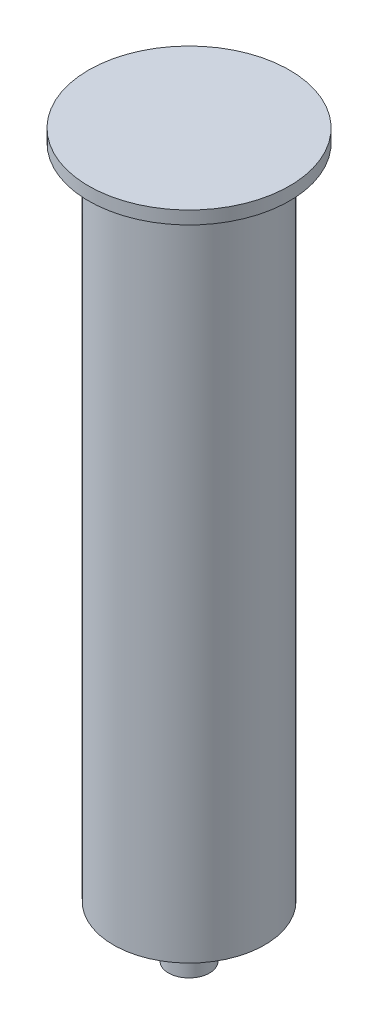
ISO-10303-21;
HEADER;
FILE_DESCRIPTION(('STEP AP214'),'2;1');
FILE_NAME('part.step','',(''),(''),'','','');
FILE_SCHEMA(('AUTOMOTIVE_DESIGN { 1 0 10303 214 1 1 1 1 }'));
ENDSEC;
DATA;
#1=APPLICATION_CONTEXT('core data for automotive mechanical design processes');
#2=APPLICATION_PROTOCOL_DEFINITION('international standard','automotive_design',2000,#1);
#3=PRODUCT_CONTEXT('',#1,'mechanical');
#4=PRODUCT('Part','Part','',(#3));
#5=PRODUCT_RELATED_PRODUCT_CATEGORY('part','',(#4));
#6=PRODUCT_DEFINITION_FORMATION('','',#4);
#7=PRODUCT_DEFINITION_CONTEXT('part definition',#1,'design');
#8=PRODUCT_DEFINITION('design','',#6,#7);
#9=PRODUCT_DEFINITION_SHAPE('','',#8);
#10=(LENGTH_UNIT() NAMED_UNIT(*) SI_UNIT(.MILLI.,.METRE.));
#11=(NAMED_UNIT(*) PLANE_ANGLE_UNIT() SI_UNIT($,.RADIAN.));
#12=(NAMED_UNIT(*) SI_UNIT($,.STERADIAN.) SOLID_ANGLE_UNIT());
#13=UNCERTAINTY_MEASURE_WITH_UNIT(LENGTH_MEASURE(1.E-05),#10,'distance_accuracy_value','');
#14=(GEOMETRIC_REPRESENTATION_CONTEXT(3) GLOBAL_UNCERTAINTY_ASSIGNED_CONTEXT((#13)) GLOBAL_UNIT_ASSIGNED_CONTEXT((#10,
#11,#12)) REPRESENTATION_CONTEXT('',''));
#15=CARTESIAN_POINT('',(0.,0.,0.));
#16=DIRECTION('',(0.,0.,1.));
#17=DIRECTION('',(1.,0.,0.));
#18=AXIS2_PLACEMENT_3D('',#15,#16,#17);
#19=CARTESIAN_POINT('',(0.,0.,0.));
#20=DIRECTION('',(0.,1.,0.));
#21=DIRECTION('',(-1.,0.,0.));
#22=AXIS2_PLACEMENT_3D('',#19,#20,#21);
#23=PLANE('',#22);
#24=CARTESIAN_POINT('',(0.,0.,0.));
#25=DIRECTION('',(0.,1.,0.));
#26=DIRECTION('',(-1.,0.,0.));
#27=AXIS2_PLACEMENT_3D('',#24,#25,#26);
#28=CIRCLE('',#27,23.25);
#29=CARTESIAN_POINT('',(-23.25,0.,0.));
#30=VERTEX_POINT('',#29);
#31=EDGE_CURVE('E10',#30,#30,#28,.T.);
#32=ORIENTED_EDGE('',*,*,#31,.T.);
#33=EDGE_LOOP('',(#32));
#34=FACE_BOUND('',#33,.T.);
#35=ADVANCED_FACE('F37',(#34),#23,.T.);
#36=CARTESIAN_POINT('',(0.,0.,0.));
#37=DIRECTION('',(0.,1.,0.));
#38=DIRECTION('',(-1.,0.,0.));
#39=AXIS2_PLACEMENT_3D('',#36,#37,#38);
#40=CYLINDRICAL_SURFACE('',#39,23.25);
#41=CARTESIAN_POINT('',(0.,-3.,0.));
#42=DIRECTION('',(0.,1.,0.));
#43=DIRECTION('',(-1.,0.,0.));
#44=AXIS2_PLACEMENT_3D('',#41,#42,#43);
#45=CIRCLE('',#44,23.25);
#46=CARTESIAN_POINT('',(-23.25,-3.,0.));
#47=VERTEX_POINT('',#46);
#48=EDGE_CURVE('E43',#47,#47,#45,.T.);
#49=ORIENTED_EDGE('',*,*,#48,.T.);
#50=EDGE_LOOP('',(#49));
#51=FACE_BOUND('',#50,.T.);
#52=ORIENTED_EDGE('',*,*,#31,.F.);
#53=EDGE_LOOP('',(#52));
#54=FACE_BOUND('',#53,.T.);
#55=ADVANCED_FACE('F75',(#51,#54),#40,.T.);
#56=CARTESIAN_POINT('',(-23.25,-3.,0.));
#57=DIRECTION('',(0.,-1.,0.));
#58=DIRECTION('',(1.,0.,0.));
#59=AXIS2_PLACEMENT_3D('',#56,#57,#58);
#60=PLANE('',#59);
#61=CARTESIAN_POINT('',(0.,-3.,0.));
#62=DIRECTION('',(0.,1.,0.));
#63=DIRECTION('',(-1.,0.,0.));
#64=AXIS2_PLACEMENT_3D('',#61,#62,#63);
#65=CIRCLE('',#64,17.5);
#66=CARTESIAN_POINT('',(-17.5,-3.,0.));
#67=VERTEX_POINT('',#66);
#68=EDGE_CURVE('E47',#67,#67,#65,.T.);
#69=ORIENTED_EDGE('',*,*,#68,.T.);
#70=EDGE_LOOP('',(#69));
#71=FACE_BOUND('',#70,.T.);
#72=ORIENTED_EDGE('',*,*,#48,.F.);
#73=EDGE_LOOP('',(#72));
#74=FACE_BOUND('',#73,.T.);
#75=ADVANCED_FACE('F79',(#71,#74),#60,.T.);
#76=CARTESIAN_POINT('',(0.,0.,0.));
#77=DIRECTION('',(0.,1.,0.));
#78=DIRECTION('',(-1.,0.,0.));
#79=AXIS2_PLACEMENT_3D('',#76,#77,#78);
#80=CYLINDRICAL_SURFACE('',#79,17.5);
#81=CARTESIAN_POINT('',(0.,-155.,0.));
#82=DIRECTION('',(0.,1.,0.));
#83=DIRECTION('',(-1.,0.,0.));
#84=AXIS2_PLACEMENT_3D('',#81,#82,#83);
#85=CIRCLE('',#84,17.5);
#86=CARTESIAN_POINT('',(-17.5,-155.,0.));
#87=VERTEX_POINT('',#86);
#88=EDGE_CURVE('E51',#87,#87,#85,.T.);
#89=ORIENTED_EDGE('',*,*,#88,.T.);
#90=EDGE_LOOP('',(#89));
#91=FACE_BOUND('',#90,.T.);
#92=ORIENTED_EDGE('',*,*,#68,.F.);
#93=EDGE_LOOP('',(#92));
#94=FACE_BOUND('',#93,.T.);
#95=ADVANCED_FACE('F83',(#91,#94),#80,.T.);
#96=CARTESIAN_POINT('',(0.,-155.,0.));
#97=DIRECTION('',(0.,1.,0.));
#98=DIRECTION('',(-1.,0.,0.));
#99=AXIS2_PLACEMENT_3D('',#96,#97,#98);
#100=CONICAL_SURFACE('',#99,17.5,1.19706950682934);
#101=CARTESIAN_POINT('',(0.,-160.,0.));
#102=DIRECTION('',(0.,1.,0.));
#103=DIRECTION('',(-1.,0.,0.));
#104=AXIS2_PLACEMENT_3D('',#101,#102,#103);
#105=CIRCLE('',#104,4.75);
#106=CARTESIAN_POINT('',(-4.74999999999995,-160.,0.));
#107=VERTEX_POINT('',#106);
#108=EDGE_CURVE('E56',#107,#107,#105,.T.);
#109=CARTESIAN_POINT('',(-4.74999999999995,-160.,0.));
#110=CARTESIAN_POINT('',(-4.88281249999995,-159.947916666667,0.));
#111=CARTESIAN_POINT('',(-5.01562499999995,-159.895833333333,0.));
#112=CARTESIAN_POINT('',(-5.28124999999995,-159.791666666667,0.));
#113=CARTESIAN_POINT('',(-5.41406249999995,-159.739583333333,0.));
#114=CARTESIAN_POINT('',(-5.67968749999995,-159.635416666667,0.));
#115=CARTESIAN_POINT('',(-5.81249999999995,-159.583333333333,0.));
#116=CARTESIAN_POINT('',(-6.07812499999995,-159.479166666667,0.));
#117=CARTESIAN_POINT('',(-6.21093749999995,-159.427083333333,0.));
#118=CARTESIAN_POINT('',(-6.47656249999995,-159.322916666667,0.));
#119=CARTESIAN_POINT('',(-6.60937499999995,-159.270833333333,0.));
#120=CARTESIAN_POINT('',(-6.87499999999995,-159.166666666667,0.));
#121=CARTESIAN_POINT('',(-7.00781249999995,-159.114583333333,0.));
#122=CARTESIAN_POINT('',(-7.27343749999995,-159.010416666667,0.));
#123=CARTESIAN_POINT('',(-7.40624999999995,-158.958333333333,0.));
#124=CARTESIAN_POINT('',(-7.67187499999995,-158.854166666667,0.));
#125=CARTESIAN_POINT('',(-7.80468749999995,-158.802083333333,0.));
#126=CARTESIAN_POINT('',(-8.07031249999995,-158.697916666667,0.));
#127=CARTESIAN_POINT('',(-8.20312499999995,-158.645833333333,0.));
#128=CARTESIAN_POINT('',(-8.46874999999995,-158.541666666667,0.));
#129=CARTESIAN_POINT('',(-8.60156249999995,-158.489583333333,0.));
#130=CARTESIAN_POINT('',(-8.86718749999995,-158.385416666667,0.));
#131=CARTESIAN_POINT('',(-8.99999999999995,-158.333333333333,0.));
#132=CARTESIAN_POINT('',(-9.26562499999995,-158.229166666667,0.));
#133=CARTESIAN_POINT('',(-9.39843749999995,-158.177083333333,0.));
#134=CARTESIAN_POINT('',(-9.66406249999995,-158.072916666667,0.));
#135=CARTESIAN_POINT('',(-9.79687499999995,-158.020833333333,0.));
#136=CARTESIAN_POINT('',(-10.0625,-157.916666666667,0.));
#137=CARTESIAN_POINT('',(-10.1953125,-157.864583333333,0.));
#138=CARTESIAN_POINT('',(-10.4609375,-157.760416666667,0.));
#139=CARTESIAN_POINT('',(-10.59375,-157.708333333333,0.));
#140=CARTESIAN_POINT('',(-10.859375,-157.604166666667,0.));
#141=CARTESIAN_POINT('',(-10.9921875,-157.552083333333,0.));
#142=CARTESIAN_POINT('',(-11.2578125,-157.447916666667,0.));
#143=CARTESIAN_POINT('',(-11.390625,-157.395833333333,0.));
#144=CARTESIAN_POINT('',(-11.6562499999999,-157.291666666667,0.));
#145=CARTESIAN_POINT('',(-11.7890625,-157.239583333333,0.));
#146=CARTESIAN_POINT('',(-12.0546875,-157.135416666667,0.));
#147=CARTESIAN_POINT('',(-12.1875,-157.083333333333,0.));
#148=CARTESIAN_POINT('',(-12.453125,-156.979166666667,0.));
#149=CARTESIAN_POINT('',(-12.5859375,-156.927083333333,0.));
#150=CARTESIAN_POINT('',(-12.8515625,-156.822916666667,0.));
#151=CARTESIAN_POINT('',(-12.984375,-156.770833333333,0.));
#152=CARTESIAN_POINT('',(-13.25,-156.666666666667,0.));
#153=CARTESIAN_POINT('',(-13.3828125,-156.614583333333,0.));
#154=CARTESIAN_POINT('',(-13.6484375,-156.510416666667,0.));
#155=CARTESIAN_POINT('',(-13.78125,-156.458333333333,0.));
#156=CARTESIAN_POINT('',(-14.046875,-156.354166666667,0.));
#157=CARTESIAN_POINT('',(-14.1796874999999,-156.302083333333,0.));
#158=CARTESIAN_POINT('',(-14.4453124999999,-156.197916666667,0.));
#159=CARTESIAN_POINT('',(-14.5781249999999,-156.145833333333,0.));
#160=CARTESIAN_POINT('',(-14.84375,-156.041666666667,0.));
#161=CARTESIAN_POINT('',(-14.9765625,-155.989583333333,0.));
#162=CARTESIAN_POINT('',(-15.2421875,-155.885416666667,0.));
#163=CARTESIAN_POINT('',(-15.375,-155.833333333333,0.));
#164=CARTESIAN_POINT('',(-15.640625,-155.729166666667,0.));
#165=CARTESIAN_POINT('',(-15.7734374999999,-155.677083333333,0.));
#166=CARTESIAN_POINT('',(-16.0390624999999,-155.572916666667,0.));
#167=CARTESIAN_POINT('',(-16.171875,-155.520833333333,0.));
#168=CARTESIAN_POINT('',(-16.4375,-155.416666666667,0.));
#169=CARTESIAN_POINT('',(-16.5703125,-155.364583333333,0.));
#170=CARTESIAN_POINT('',(-16.8359375,-155.260416666667,0.));
#171=CARTESIAN_POINT('',(-16.96875,-155.208333333333,0.));
#172=CARTESIAN_POINT('',(-17.2343749999999,-155.104166666667,0.));
#173=CARTESIAN_POINT('',(-17.3671875,-155.052083333333,0.));
#174=CARTESIAN_POINT('',(-17.5,-155.,0.));
#175=B_SPLINE_CURVE_WITH_KNOTS('',3,(#109,#110,#111,#112,#113,#114,#115,#116,#117,#118,#119,
#120,#121,#122,#123,#124,#125,#126,#127,#128,#129,#130,#131,#132,#133,#134,#135,#136,#137,#138,
#139,#140,#141,#142,#143,#144,#145,#146,#147,#148,#149,#150,#151,#152,#153,#154,#155,#156,#157,
#158,#159,#160,#161,#162,#163,#164,#165,#166,#167,#168,#169,#170,#171,#172,#173,#174),
.UNSPECIFIED.,.F.,.F.,(4,2,2,2,2,2,2,2,2,2,2,2,2,2,2,2,2,2,2,2,2,2,2,2,2,2,2,2,2,2,2,2,4),(0.,
0.427979560150082,0.855959120300153,1.28393868045022,1.7119182406003,2.13989780075037,
2.56787736090044,2.99585692105051,3.4238364812006,3.85181604135067,4.27979560150074,
4.70777516165081,5.13575472180088,5.56373428195095,5.99171384210103,6.4196934022511,
6.84767296240117,7.27565252255125,7.70363208270133,8.1316116428514,8.55959120300147,
8.98757076315154,9.41555032330161,9.84352988345168,10.2715094436018,10.6994890037518,
11.1274685639019,11.555448124052,11.983427684202,12.4114072443521,12.8393868045022,
13.2673663646523,13.6953459248023),.UNSPECIFIED.);
#176=EDGE_CURVE('BSEAM72',#107,#87,#175,.T.);
#177=ORIENTED_EDGE('',*,*,#108,.T.);
#178=ORIENTED_EDGE('',*,*,#88,.F.);
#179=ORIENTED_EDGE('',*,*,#176,.T.);
#180=ORIENTED_EDGE('',*,*,#176,.F.);
#181=EDGE_LOOP('',(#177,#179,#178,#180));
#182=FACE_BOUND('',#181,.T.);
#183=ADVANCED_FACE('F72',(#182),#100,.T.);
#184=CARTESIAN_POINT('',(0.,0.,0.));
#185=DIRECTION('',(0.,1.,0.));
#186=DIRECTION('',(-1.,0.,0.));
#187=AXIS2_PLACEMENT_3D('',#184,#185,#186);
#188=CYLINDRICAL_SURFACE('',#187,4.75);
#189=CARTESIAN_POINT('',(0.,-167.,0.));
#190=DIRECTION('',(0.,1.,0.));
#191=DIRECTION('',(-1.,0.,0.));
#192=AXIS2_PLACEMENT_3D('',#189,#190,#191);
#193=CIRCLE('',#192,4.75);
#194=CARTESIAN_POINT('',(-4.74999999999998,-167.,0.));
#195=VERTEX_POINT('',#194);
#196=EDGE_CURVE('E59',#195,#195,#193,.T.);
#197=ORIENTED_EDGE('',*,*,#196,.T.);
#198=EDGE_LOOP('',(#197));
#199=FACE_BOUND('',#198,.T.);
#200=ORIENTED_EDGE('',*,*,#108,.F.);
#201=EDGE_LOOP('',(#200));
#202=FACE_BOUND('',#201,.T.);
#203=ADVANCED_FACE('F63',(#199,#202),#188,.T.);
#204=CARTESIAN_POINT('',(-4.74999999999998,-167.,0.));
#205=DIRECTION('',(0.,-1.,0.));
#206=DIRECTION('',(1.,0.,0.));
#207=AXIS2_PLACEMENT_3D('',#204,#205,#206);
#208=PLANE('',#207);
#209=ORIENTED_EDGE('',*,*,#196,.F.);
#210=EDGE_LOOP('',(#209));
#211=FACE_BOUND('',#210,.T.);
#212=ADVANCED_FACE('F66',(#211),#208,.T.);
#213=CLOSED_SHELL('',(#35,#55,#75,#95,#183,#203,#212));
#214=MANIFOLD_SOLID_BREP('B2',#213);
#215=ADVANCED_BREP_SHAPE_REPRESENTATION('',(#18,#214),#14);
#216=SHAPE_DEFINITION_REPRESENTATION(#9,#215);
ENDSEC;
END-ISO-10303-21;
